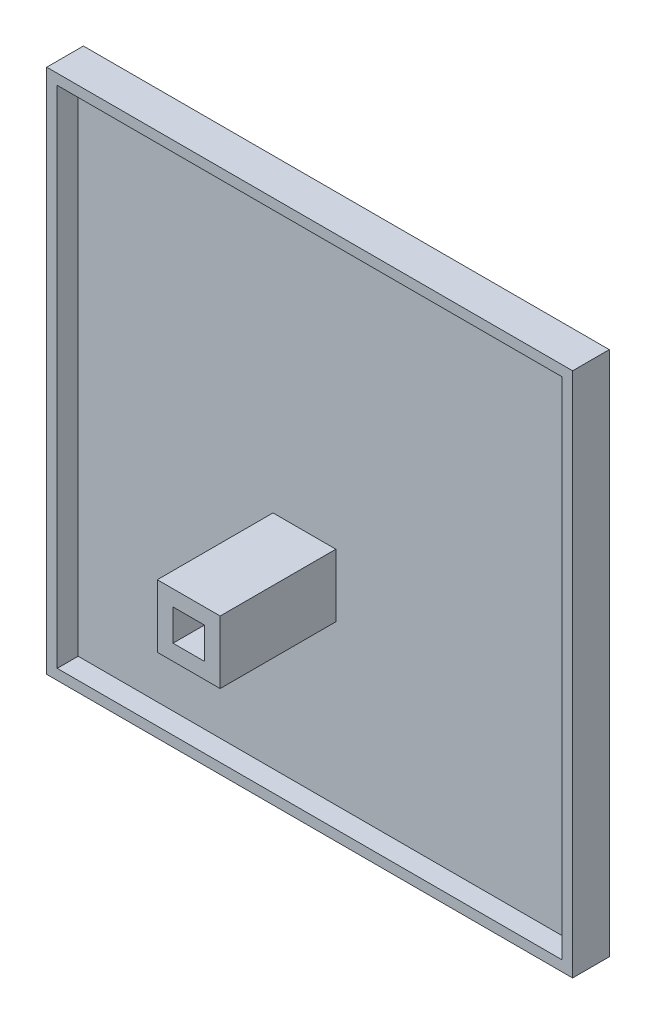
ISO-10303-21;
HEADER;
FILE_DESCRIPTION(('STEP AP214'),'2;1');
FILE_NAME('part.step','',(''),(''),'','','');
FILE_SCHEMA(('AUTOMOTIVE_DESIGN { 1 0 10303 214 1 1 1 1 }'));
ENDSEC;
DATA;
#1=APPLICATION_CONTEXT('core data for automotive mechanical design processes');
#2=APPLICATION_PROTOCOL_DEFINITION('international standard','automotive_design',2000,#1);
#3=PRODUCT_CONTEXT('',#1,'mechanical');
#4=PRODUCT('Part','Part','',(#3));
#5=PRODUCT_RELATED_PRODUCT_CATEGORY('part','',(#4));
#6=PRODUCT_DEFINITION_FORMATION('','',#4);
#7=PRODUCT_DEFINITION_CONTEXT('part definition',#1,'design');
#8=PRODUCT_DEFINITION('design','',#6,#7);
#9=PRODUCT_DEFINITION_SHAPE('','',#8);
#10=(LENGTH_UNIT() NAMED_UNIT(*) SI_UNIT(.MILLI.,.METRE.));
#11=(NAMED_UNIT(*) PLANE_ANGLE_UNIT() SI_UNIT($,.RADIAN.));
#12=(NAMED_UNIT(*) SI_UNIT($,.STERADIAN.) SOLID_ANGLE_UNIT());
#13=UNCERTAINTY_MEASURE_WITH_UNIT(LENGTH_MEASURE(1.E-05),#10,'distance_accuracy_value','');
#14=(GEOMETRIC_REPRESENTATION_CONTEXT(3) GLOBAL_UNCERTAINTY_ASSIGNED_CONTEXT((#13)) GLOBAL_UNIT_ASSIGNED_CONTEXT((#10,
#11,#12)) REPRESENTATION_CONTEXT('',''));
#15=CARTESIAN_POINT('',(0.,0.,0.));
#16=DIRECTION('',(0.,0.,1.));
#17=DIRECTION('',(1.,0.,0.));
#18=AXIS2_PLACEMENT_3D('',#15,#16,#17);
#19=CARTESIAN_POINT('',(42.2,-59.1,2.));
#20=DIRECTION('',(-1.,0.,0.));
#21=DIRECTION('',(0.,-1.,0.));
#22=AXIS2_PLACEMENT_3D('',#19,#20,#21);
#23=PLANE('',#22);
#24=DIRECTION('',(0.,-1.,0.));
#25=VECTOR('',#24,1.);
#26=CARTESIAN_POINT('',(42.2,-59.1,4.));
#27=LINE('',#26,#25);
#28=CARTESIAN_POINT('',(42.2,-59.1,4.));
#29=VERTEX_POINT('',#28);
#30=CARTESIAN_POINT('',(42.2,-65.1,4.));
#31=VERTEX_POINT('',#30);
#32=EDGE_CURVE('E61',#29,#31,#27,.T.);
#33=ORIENTED_EDGE('',*,*,#32,.F.);
#34=DIRECTION('',(0.,0.,1.));
#35=VECTOR('',#34,1.);
#36=CARTESIAN_POINT('',(42.2,-59.1,2.));
#37=LINE('',#36,#35);
#38=CARTESIAN_POINT('',(42.2,-59.1,24.09));
#39=VERTEX_POINT('',#38);
#40=EDGE_CURVE('E220',#29,#39,#37,.T.);
#41=ORIENTED_EDGE('',*,*,#40,.T.);
#42=DIRECTION('',(0.,-1.,0.));
#43=VECTOR('',#42,1.);
#44=CARTESIAN_POINT('',(42.2,-59.1,24.09));
#45=LINE('',#44,#43);
#46=CARTESIAN_POINT('',(42.2,-65.1,24.09));
#47=VERTEX_POINT('',#46);
#48=EDGE_CURVE('E203',#39,#47,#45,.T.);
#49=ORIENTED_EDGE('',*,*,#48,.T.);
#50=DIRECTION('',(0.,0.,1.));
#51=VECTOR('',#50,1.);
#52=CARTESIAN_POINT('',(42.2,-65.1,2.));
#53=LINE('',#52,#51);
#54=EDGE_CURVE('E219',#31,#47,#53,.T.);
#55=ORIENTED_EDGE('',*,*,#54,.F.);
#56=EDGE_LOOP('',(#33,#41,#49,#55));
#57=FACE_BOUND('',#56,.T.);
#58=ADVANCED_FACE('F45',(#57),#23,.F.);
#59=CARTESIAN_POINT('',(42.2,-59.1,2.));
#60=DIRECTION('',(0.,1.,0.));
#61=DIRECTION('',(0.,0.,1.));
#62=AXIS2_PLACEMENT_3D('',#59,#60,#61);
#63=PLANE('',#62);
#64=DIRECTION('',(-1.,0.,0.));
#65=VECTOR('',#64,1.);
#66=CARTESIAN_POINT('',(48.2,-59.1,4.));
#67=LINE('',#66,#65);
#68=CARTESIAN_POINT('',(48.2,-59.1,4.));
#69=VERTEX_POINT('',#68);
#70=EDGE_CURVE('E68',#69,#29,#67,.T.);
#71=ORIENTED_EDGE('',*,*,#70,.F.);
#72=DIRECTION('',(0.,0.,1.));
#73=VECTOR('',#72,1.);
#74=CARTESIAN_POINT('',(48.2,-59.1,2.));
#75=LINE('',#74,#73);
#76=CARTESIAN_POINT('',(48.2,-59.1,24.09));
#77=VERTEX_POINT('',#76);
#78=EDGE_CURVE('E224',#69,#77,#75,.T.);
#79=ORIENTED_EDGE('',*,*,#78,.T.);
#80=DIRECTION('',(-1.,0.,0.));
#81=VECTOR('',#80,1.);
#82=CARTESIAN_POINT('',(42.2,-59.1,24.09));
#83=LINE('',#82,#81);
#84=EDGE_CURVE('E215',#77,#39,#83,.T.);
#85=ORIENTED_EDGE('',*,*,#84,.T.);
#86=ORIENTED_EDGE('',*,*,#40,.F.);
#87=EDGE_LOOP('',(#71,#79,#85,#86));
#88=FACE_BOUND('',#87,.T.);
#89=ADVANCED_FACE('F353',(#88),#63,.F.);
#90=CARTESIAN_POINT('',(48.2,-59.1,2.));
#91=DIRECTION('',(1.,0.,0.));
#92=DIRECTION('',(0.,0.,-1.));
#93=AXIS2_PLACEMENT_3D('',#90,#91,#92);
#94=PLANE('',#93);
#95=DIRECTION('',(0.,1.,0.));
#96=VECTOR('',#95,1.);
#97=CARTESIAN_POINT('',(48.2,-59.1,4.));
#98=LINE('',#97,#96);
#99=CARTESIAN_POINT('',(48.2,-65.1,4.));
#100=VERTEX_POINT('',#99);
#101=EDGE_CURVE('E191',#100,#69,#98,.T.);
#102=ORIENTED_EDGE('',*,*,#101,.F.);
#103=DIRECTION('',(0.,0.,1.));
#104=VECTOR('',#103,1.);
#105=CARTESIAN_POINT('',(48.2,-65.1,2.));
#106=LINE('',#105,#104);
#107=CARTESIAN_POINT('',(48.2,-65.1,24.09));
#108=VERTEX_POINT('',#107);
#109=EDGE_CURVE('E227',#100,#108,#106,.T.);
#110=ORIENTED_EDGE('',*,*,#109,.T.);
#111=DIRECTION('',(0.,1.,0.));
#112=VECTOR('',#111,1.);
#113=CARTESIAN_POINT('',(48.2,-59.1,24.09));
#114=LINE('',#113,#112);
#115=EDGE_CURVE('E211',#108,#77,#114,.T.);
#116=ORIENTED_EDGE('',*,*,#115,.T.);
#117=ORIENTED_EDGE('',*,*,#78,.F.);
#118=EDGE_LOOP('',(#102,#110,#116,#117));
#119=FACE_BOUND('',#118,.T.);
#120=ADVANCED_FACE('F358',(#119),#94,.F.);
#121=CARTESIAN_POINT('',(42.2,-65.1,2.));
#122=DIRECTION('',(0.,-1.,0.));
#123=DIRECTION('',(0.,0.,-1.));
#124=AXIS2_PLACEMENT_3D('',#121,#122,#123);
#125=PLANE('',#124);
#126=DIRECTION('',(1.,0.,0.));
#127=VECTOR('',#126,1.);
#128=CARTESIAN_POINT('',(48.2,-65.1,4.));
#129=LINE('',#128,#127);
#130=EDGE_CURVE('E199',#31,#100,#129,.T.);
#131=ORIENTED_EDGE('',*,*,#130,.F.);
#132=ORIENTED_EDGE('',*,*,#54,.T.);
#133=DIRECTION('',(1.,0.,0.));
#134=VECTOR('',#133,1.);
#135=CARTESIAN_POINT('',(42.2,-65.1,24.09));
#136=LINE('',#135,#134);
#137=EDGE_CURVE('E207',#47,#108,#136,.T.);
#138=ORIENTED_EDGE('',*,*,#137,.T.);
#139=ORIENTED_EDGE('',*,*,#109,.F.);
#140=EDGE_LOOP('',(#131,#132,#138,#139));
#141=FACE_BOUND('',#140,.T.);
#142=ADVANCED_FACE('F362',(#141),#125,.F.);
#143=CARTESIAN_POINT('',(0.,0.,2.));
#144=DIRECTION('',(0.,0.,1.));
#145=DIRECTION('',(1.,0.,0.));
#146=AXIS2_PLACEMENT_3D('',#143,#144,#145);
#147=PLANE('',#146);
#148=DIRECTION('',(-1.,0.,0.));
#149=VECTOR('',#148,1.);
#150=CARTESIAN_POINT('',(0.,-98.4,2.));
#151=LINE('',#150,#149);
#152=CARTESIAN_POINT('',(98.4,-98.4,2.));
#153=VERTEX_POINT('',#152);
#154=CARTESIAN_POINT('',(2.00000000000001,-98.4,2.));
#155=VERTEX_POINT('',#154);
#156=EDGE_CURVE('E302',#153,#155,#151,.T.);
#157=ORIENTED_EDGE('',*,*,#156,.F.);
#158=DIRECTION('',(0.,-1.,0.));
#159=VECTOR('',#158,1.);
#160=CARTESIAN_POINT('',(98.4,-2.00000000000001,2.));
#161=LINE('',#160,#159);
#162=CARTESIAN_POINT('',(98.4,-2.00000000000001,2.));
#163=VERTEX_POINT('',#162);
#164=EDGE_CURVE('E280',#163,#153,#161,.T.);
#165=ORIENTED_EDGE('',*,*,#164,.F.);
#166=DIRECTION('',(-1.,0.,0.));
#167=VECTOR('',#166,1.);
#168=CARTESIAN_POINT('',(0.,-2.00000000000001,2.));
#169=LINE('',#168,#167);
#170=CARTESIAN_POINT('',(2.,-2.00000000000001,2.));
#171=VERTEX_POINT('',#170);
#172=EDGE_CURVE('E310',#163,#171,#169,.T.);
#173=ORIENTED_EDGE('',*,*,#172,.T.);
#174=DIRECTION('',(0.,1.,0.));
#175=VECTOR('',#174,1.);
#176=CARTESIAN_POINT('',(2.,-2.00000000000001,2.));
#177=LINE('',#176,#175);
#178=EDGE_CURVE('E283',#155,#171,#177,.T.);
#179=ORIENTED_EDGE('',*,*,#178,.F.);
#180=EDGE_LOOP('',(#157,#165,#173,#179));
#181=FACE_BOUND('',#180,.T.);
#182=DIRECTION('',(1.,0.,0.));
#183=VECTOR('',#182,1.);
#184=CARTESIAN_POINT('',(39.2,-68.1,2.));
#185=LINE('',#184,#183);
#186=CARTESIAN_POINT('',(39.2,-68.1,2.));
#187=VERTEX_POINT('',#186);
#188=CARTESIAN_POINT('',(51.2,-68.1,2.));
#189=VERTEX_POINT('',#188);
#190=EDGE_CURVE('E250',#187,#189,#185,.T.);
#191=ORIENTED_EDGE('',*,*,#190,.F.);
#192=DIRECTION('',(0.,-1.,0.));
#193=VECTOR('',#192,1.);
#194=CARTESIAN_POINT('',(39.2,-56.1,2.));
#195=LINE('',#194,#193);
#196=CARTESIAN_POINT('',(39.2,-56.1,2.));
#197=VERTEX_POINT('',#196);
#198=EDGE_CURVE('E223',#197,#187,#195,.T.);
#199=ORIENTED_EDGE('',*,*,#198,.F.);
#200=DIRECTION('',(-1.,0.,0.));
#201=VECTOR('',#200,1.);
#202=CARTESIAN_POINT('',(39.2,-56.1,2.));
#203=LINE('',#202,#201);
#204=CARTESIAN_POINT('',(51.2,-56.1,2.));
#205=VERTEX_POINT('',#204);
#206=EDGE_CURVE('E237',#205,#197,#203,.T.);
#207=ORIENTED_EDGE('',*,*,#206,.F.);
#208=DIRECTION('',(0.,1.,0.));
#209=VECTOR('',#208,1.);
#210=CARTESIAN_POINT('',(51.2,-56.1,2.));
#211=LINE('',#210,#209);
#212=EDGE_CURVE('E253',#189,#205,#211,.T.);
#213=ORIENTED_EDGE('',*,*,#212,.F.);
#214=EDGE_LOOP('',(#191,#199,#207,#213));
#215=FACE_BOUND('',#214,.T.);
#216=ADVANCED_FACE('F395',(#181,#215),#147,.T.);
#217=CARTESIAN_POINT('',(0.,-2.00000000000001,6.));
#218=DIRECTION('',(0.,-1.,0.));
#219=DIRECTION('',(1.,0.,0.));
#220=AXIS2_PLACEMENT_3D('',#217,#218,#219);
#221=PLANE('',#220);
#222=ORIENTED_EDGE('',*,*,#172,.F.);
#223=DIRECTION('',(0.,0.,-1.));
#224=VECTOR('',#223,1.);
#225=CARTESIAN_POINT('',(98.4,-2.00000000000001,6.));
#226=LINE('',#225,#224);
#227=CARTESIAN_POINT('',(98.4,-2.00000000000001,6.));
#228=VERTEX_POINT('',#227);
#229=EDGE_CURVE('E272',#228,#163,#226,.T.);
#230=ORIENTED_EDGE('',*,*,#229,.F.);
#231=DIRECTION('',(-1.,0.,0.));
#232=VECTOR('',#231,1.);
#233=CARTESIAN_POINT('',(0.,-2.00000000000001,6.));
#234=LINE('',#233,#232);
#235=CARTESIAN_POINT('',(2.,-2.00000000000001,6.));
#236=VERTEX_POINT('',#235);
#237=EDGE_CURVE('E313',#228,#236,#234,.T.);
#238=ORIENTED_EDGE('',*,*,#237,.T.);
#239=DIRECTION('',(0.,0.,-1.));
#240=VECTOR('',#239,1.);
#241=CARTESIAN_POINT('',(2.,-2.00000000000001,6.));
#242=LINE('',#241,#240);
#243=EDGE_CURVE('E291',#236,#171,#242,.T.);
#244=ORIENTED_EDGE('',*,*,#243,.T.);
#245=EDGE_LOOP('',(#222,#230,#238,#244));
#246=FACE_BOUND('',#245,.T.);
#247=ADVANCED_FACE('F389',(#246),#221,.T.);
#248=CARTESIAN_POINT('',(0.,-98.4,6.));
#249=DIRECTION('',(0.,-1.,0.));
#250=DIRECTION('',(1.,0.,0.));
#251=AXIS2_PLACEMENT_3D('',#248,#249,#250);
#252=PLANE('',#251);
#253=DIRECTION('',(0.,0.,-1.));
#254=VECTOR('',#253,1.);
#255=CARTESIAN_POINT('',(98.4,-98.4,6.));
#256=LINE('',#255,#254);
#257=CARTESIAN_POINT('',(98.4,-98.4,6.));
#258=VERTEX_POINT('',#257);
#259=EDGE_CURVE('E275',#258,#153,#256,.T.);
#260=ORIENTED_EDGE('',*,*,#259,.T.);
#261=ORIENTED_EDGE('',*,*,#156,.T.);
#262=DIRECTION('',(0.,0.,-1.));
#263=VECTOR('',#262,1.);
#264=CARTESIAN_POINT('',(2.00000000000001,-98.4,6.));
#265=LINE('',#264,#263);
#266=CARTESIAN_POINT('',(2.00000000000001,-98.4,6.));
#267=VERTEX_POINT('',#266);
#268=EDGE_CURVE('E298',#267,#155,#265,.T.);
#269=ORIENTED_EDGE('',*,*,#268,.F.);
#270=DIRECTION('',(-1.,0.,0.));
#271=VECTOR('',#270,1.);
#272=CARTESIAN_POINT('',(0.,-98.4,6.));
#273=LINE('',#272,#271);
#274=EDGE_CURVE('E303',#258,#267,#273,.T.);
#275=ORIENTED_EDGE('',*,*,#274,.F.);
#276=EDGE_LOOP('',(#260,#261,#269,#275));
#277=FACE_BOUND('',#276,.T.);
#278=ADVANCED_FACE('F387',(#277),#252,.F.);
#279=CARTESIAN_POINT('',(0.,0.,2.));
#280=DIRECTION('',(1.,0.,0.));
#281=DIRECTION('',(0.,1.,0.));
#282=AXIS2_PLACEMENT_3D('',#279,#280,#281);
#283=PLANE('',#282);
#284=DIRECTION('',(0.,0.,-1.));
#285=VECTOR('',#284,1.);
#286=CARTESIAN_POINT('',(0.,0.,2.));
#287=LINE('',#286,#285);
#288=CARTESIAN_POINT('',(0.,0.,6.));
#289=VERTEX_POINT('',#288);
#290=CARTESIAN_POINT('',(0.,0.,-1.));
#291=VERTEX_POINT('',#290);
#292=EDGE_CURVE('E159',#289,#291,#287,.T.);
#293=ORIENTED_EDGE('',*,*,#292,.T.);
#294=DIRECTION('',(0.,1.,0.));
#295=VECTOR('',#294,1.);
#296=CARTESIAN_POINT('',(0.,0.,-1.));
#297=LINE('',#296,#295);
#298=CARTESIAN_POINT('',(0.,-100.4,-1.));
#299=VERTEX_POINT('',#298);
#300=EDGE_CURVE('E163',#299,#291,#297,.T.);
#301=ORIENTED_EDGE('',*,*,#300,.F.);
#302=DIRECTION('',(0.,0.,-1.));
#303=VECTOR('',#302,1.);
#304=CARTESIAN_POINT('',(0.,-100.4,2.));
#305=LINE('',#304,#303);
#306=CARTESIAN_POINT('',(0.,-100.4,6.));
#307=VERTEX_POINT('',#306);
#308=EDGE_CURVE('E11',#307,#299,#305,.T.);
#309=ORIENTED_EDGE('',*,*,#308,.F.);
#310=DIRECTION('',(0.,-1.,0.));
#311=VECTOR('',#310,1.);
#312=CARTESIAN_POINT('',(0.,0.,6.));
#313=LINE('',#312,#311);
#314=EDGE_CURVE('E164',#289,#307,#313,.T.);
#315=ORIENTED_EDGE('',*,*,#314,.F.);
#316=EDGE_LOOP('',(#293,#301,#309,#315));
#317=FACE_BOUND('',#316,.T.);
#318=ADVANCED_FACE('F47',(#317),#283,.F.);
#319=CARTESIAN_POINT('',(0.,-100.4,2.));
#320=DIRECTION('',(0.,1.,0.));
#321=DIRECTION('',(0.,0.,1.));
#322=AXIS2_PLACEMENT_3D('',#319,#320,#321);
#323=PLANE('',#322);
#324=ORIENTED_EDGE('',*,*,#308,.T.);
#325=DIRECTION('',(-1.,0.,0.));
#326=VECTOR('',#325,1.);
#327=CARTESIAN_POINT('',(0.,-100.4,-1.));
#328=LINE('',#327,#326);
#329=CARTESIAN_POINT('',(100.4,-100.4,-1.));
#330=VERTEX_POINT('',#329);
#331=EDGE_CURVE('E183',#330,#299,#328,.T.);
#332=ORIENTED_EDGE('',*,*,#331,.F.);
#333=DIRECTION('',(0.,0.,-1.));
#334=VECTOR('',#333,1.);
#335=CARTESIAN_POINT('',(100.4,-100.4,2.));
#336=LINE('',#335,#334);
#337=CARTESIAN_POINT('',(100.4,-100.4,6.));
#338=VERTEX_POINT('',#337);
#339=EDGE_CURVE('E54',#338,#330,#336,.T.);
#340=ORIENTED_EDGE('',*,*,#339,.F.);
#341=DIRECTION('',(1.,0.,0.));
#342=VECTOR('',#341,1.);
#343=CARTESIAN_POINT('',(0.,-100.4,6.));
#344=LINE('',#343,#342);
#345=EDGE_CURVE('E306',#307,#338,#344,.T.);
#346=ORIENTED_EDGE('',*,*,#345,.F.);
#347=EDGE_LOOP('',(#324,#332,#340,#346));
#348=FACE_BOUND('',#347,.T.);
#349=ADVANCED_FACE('F334',(#348),#323,.F.);
#350=CARTESIAN_POINT('',(100.4,0.,2.));
#351=DIRECTION('',(1.,0.,0.));
#352=DIRECTION('',(0.,1.,0.));
#353=AXIS2_PLACEMENT_3D('',#350,#351,#352);
#354=PLANE('',#353);
#355=ORIENTED_EDGE('',*,*,#339,.T.);
#356=DIRECTION('',(0.,-1.,0.));
#357=VECTOR('',#356,1.);
#358=CARTESIAN_POINT('',(100.4,0.,-1.));
#359=LINE('',#358,#357);
#360=CARTESIAN_POINT('',(100.4,0.,-1.));
#361=VERTEX_POINT('',#360);
#362=EDGE_CURVE('E178',#361,#330,#359,.T.);
#363=ORIENTED_EDGE('',*,*,#362,.F.);
#364=DIRECTION('',(0.,0.,-1.));
#365=VECTOR('',#364,1.);
#366=CARTESIAN_POINT('',(100.4,0.,2.));
#367=LINE('',#366,#365);
#368=CARTESIAN_POINT('',(100.4,0.,6.));
#369=VERTEX_POINT('',#368);
#370=EDGE_CURVE('E169',#369,#361,#367,.T.);
#371=ORIENTED_EDGE('',*,*,#370,.F.);
#372=DIRECTION('',(0.,1.,0.));
#373=VECTOR('',#372,1.);
#374=CARTESIAN_POINT('',(100.4,0.,6.));
#375=LINE('',#374,#373);
#376=EDGE_CURVE('E316',#338,#369,#375,.T.);
#377=ORIENTED_EDGE('',*,*,#376,.F.);
#378=EDGE_LOOP('',(#355,#363,#371,#377));
#379=FACE_BOUND('',#378,.T.);
#380=ADVANCED_FACE('F331',(#379),#354,.T.);
#381=CARTESIAN_POINT('',(0.,0.,2.));
#382=DIRECTION('',(0.,1.,0.));
#383=DIRECTION('',(0.,0.,1.));
#384=AXIS2_PLACEMENT_3D('',#381,#382,#383);
#385=PLANE('',#384);
#386=ORIENTED_EDGE('',*,*,#370,.T.);
#387=DIRECTION('',(1.,0.,0.));
#388=VECTOR('',#387,1.);
#389=CARTESIAN_POINT('',(0.,0.,-1.));
#390=LINE('',#389,#388);
#391=EDGE_CURVE('E172',#291,#361,#390,.T.);
#392=ORIENTED_EDGE('',*,*,#391,.F.);
#393=ORIENTED_EDGE('',*,*,#292,.F.);
#394=DIRECTION('',(-1.,0.,0.));
#395=VECTOR('',#394,1.);
#396=CARTESIAN_POINT('',(0.,0.,6.));
#397=LINE('',#396,#395);
#398=EDGE_CURVE('E320',#369,#289,#397,.T.);
#399=ORIENTED_EDGE('',*,*,#398,.F.);
#400=EDGE_LOOP('',(#386,#392,#393,#399));
#401=FACE_BOUND('',#400,.T.);
#402=ADVANCED_FACE('F173',(#401),#385,.T.);
#403=CARTESIAN_POINT('',(0.,0.,6.));
#404=DIRECTION('',(0.,0.,1.));
#405=DIRECTION('',(1.,0.,0.));
#406=AXIS2_PLACEMENT_3D('',#403,#404,#405);
#407=PLANE('',#406);
#408=ORIENTED_EDGE('',*,*,#237,.F.);
#409=DIRECTION('',(0.,-1.,0.));
#410=VECTOR('',#409,1.);
#411=CARTESIAN_POINT('',(98.4,-2.00000000000001,6.));
#412=LINE('',#411,#410);
#413=EDGE_CURVE('E279',#228,#258,#412,.T.);
#414=ORIENTED_EDGE('',*,*,#413,.T.);
#415=ORIENTED_EDGE('',*,*,#274,.T.);
#416=DIRECTION('',(0.,1.,0.));
#417=VECTOR('',#416,1.);
#418=CARTESIAN_POINT('',(2.,-2.00000000000001,6.));
#419=LINE('',#418,#417);
#420=EDGE_CURVE('E287',#267,#236,#419,.T.);
#421=ORIENTED_EDGE('',*,*,#420,.T.);
#422=EDGE_LOOP('',(#408,#414,#415,#421));
#423=FACE_BOUND('',#422,.T.);
#424=ORIENTED_EDGE('',*,*,#345,.T.);
#425=ORIENTED_EDGE('',*,*,#376,.T.);
#426=ORIENTED_EDGE('',*,*,#398,.T.);
#427=ORIENTED_EDGE('',*,*,#314,.T.);
#428=EDGE_LOOP('',(#424,#425,#426,#427));
#429=FACE_BOUND('',#428,.T.);
#430=ADVANCED_FACE('F336',(#423,#429),#407,.T.);
#431=CARTESIAN_POINT('',(2.,-2.00000000000001,6.));
#432=DIRECTION('',(-1.,0.,0.));
#433=DIRECTION('',(0.,-1.,0.));
#434=AXIS2_PLACEMENT_3D('',#431,#432,#433);
#435=PLANE('',#434);
#436=ORIENTED_EDGE('',*,*,#178,.T.);
#437=ORIENTED_EDGE('',*,*,#243,.F.);
#438=ORIENTED_EDGE('',*,*,#420,.F.);
#439=ORIENTED_EDGE('',*,*,#268,.T.);
#440=EDGE_LOOP('',(#436,#437,#438,#439));
#441=FACE_BOUND('',#440,.T.);
#442=ADVANCED_FACE('F338',(#441),#435,.F.);
#443=CARTESIAN_POINT('',(98.4,-2.00000000000001,6.));
#444=DIRECTION('',(1.,0.,0.));
#445=DIRECTION('',(0.,1.,0.));
#446=AXIS2_PLACEMENT_3D('',#443,#444,#445);
#447=PLANE('',#446);
#448=ORIENTED_EDGE('',*,*,#164,.T.);
#449=ORIENTED_EDGE('',*,*,#259,.F.);
#450=ORIENTED_EDGE('',*,*,#413,.F.);
#451=ORIENTED_EDGE('',*,*,#229,.T.);
#452=EDGE_LOOP('',(#448,#449,#450,#451));
#453=FACE_BOUND('',#452,.T.);
#454=ADVANCED_FACE('F345',(#453),#447,.F.);
#455=CARTESIAN_POINT('',(39.2,-56.1,24.09));
#456=DIRECTION('',(1.,0.,0.));
#457=DIRECTION('',(0.,1.,0.));
#458=AXIS2_PLACEMENT_3D('',#455,#456,#457);
#459=PLANE('',#458);
#460=ORIENTED_EDGE('',*,*,#198,.T.);
#461=DIRECTION('',(0.,0.,-1.));
#462=VECTOR('',#461,1.);
#463=CARTESIAN_POINT('',(39.2,-68.1,24.09));
#464=LINE('',#463,#462);
#465=CARTESIAN_POINT('',(39.2,-68.1,24.09));
#466=VERTEX_POINT('',#465);
#467=EDGE_CURVE('E269',#466,#187,#464,.T.);
#468=ORIENTED_EDGE('',*,*,#467,.F.);
#469=DIRECTION('',(0.,-1.,0.));
#470=VECTOR('',#469,1.);
#471=CARTESIAN_POINT('',(39.2,-56.1,24.09));
#472=LINE('',#471,#470);
#473=CARTESIAN_POINT('',(39.2,-56.1,24.09));
#474=VERTEX_POINT('',#473);
#475=EDGE_CURVE('E232',#474,#466,#472,.T.);
#476=ORIENTED_EDGE('',*,*,#475,.F.);
#477=DIRECTION('',(0.,0.,-1.));
#478=VECTOR('',#477,1.);
#479=CARTESIAN_POINT('',(39.2,-56.1,24.09));
#480=LINE('',#479,#478);
#481=EDGE_CURVE('E246',#474,#197,#480,.T.);
#482=ORIENTED_EDGE('',*,*,#481,.T.);
#483=EDGE_LOOP('',(#460,#468,#476,#482));
#484=FACE_BOUND('',#483,.T.);
#485=ADVANCED_FACE('F380',(#484),#459,.F.);
#486=CARTESIAN_POINT('',(39.2,-68.1,24.09));
#487=DIRECTION('',(0.,1.,0.));
#488=DIRECTION('',(0.,0.,1.));
#489=AXIS2_PLACEMENT_3D('',#486,#487,#488);
#490=PLANE('',#489);
#491=ORIENTED_EDGE('',*,*,#190,.T.);
#492=DIRECTION('',(0.,0.,-1.));
#493=VECTOR('',#492,1.);
#494=CARTESIAN_POINT('',(51.2,-68.1,24.09));
#495=LINE('',#494,#493);
#496=CARTESIAN_POINT('',(51.2,-68.1,24.09));
#497=VERTEX_POINT('',#496);
#498=EDGE_CURVE('E265',#497,#189,#495,.T.);
#499=ORIENTED_EDGE('',*,*,#498,.F.);
#500=DIRECTION('',(1.,0.,0.));
#501=VECTOR('',#500,1.);
#502=CARTESIAN_POINT('',(39.2,-68.1,24.09));
#503=LINE('',#502,#501);
#504=EDGE_CURVE('E236',#466,#497,#503,.T.);
#505=ORIENTED_EDGE('',*,*,#504,.F.);
#506=ORIENTED_EDGE('',*,*,#467,.T.);
#507=EDGE_LOOP('',(#491,#499,#505,#506));
#508=FACE_BOUND('',#507,.T.);
#509=ADVANCED_FACE('F376',(#508),#490,.F.);
#510=CARTESIAN_POINT('',(51.2,-56.1,24.09));
#511=DIRECTION('',(-1.,0.,0.));
#512=DIRECTION('',(0.,0.,1.));
#513=AXIS2_PLACEMENT_3D('',#510,#511,#512);
#514=PLANE('',#513);
#515=ORIENTED_EDGE('',*,*,#212,.T.);
#516=DIRECTION('',(0.,0.,-1.));
#517=VECTOR('',#516,1.);
#518=CARTESIAN_POINT('',(51.2,-56.1,24.09));
#519=LINE('',#518,#517);
#520=CARTESIAN_POINT('',(51.2,-56.1,24.09));
#521=VERTEX_POINT('',#520);
#522=EDGE_CURVE('E262',#521,#205,#519,.T.);
#523=ORIENTED_EDGE('',*,*,#522,.F.);
#524=DIRECTION('',(0.,1.,0.));
#525=VECTOR('',#524,1.);
#526=CARTESIAN_POINT('',(51.2,-56.1,24.09));
#527=LINE('',#526,#525);
#528=EDGE_CURVE('E240',#497,#521,#527,.T.);
#529=ORIENTED_EDGE('',*,*,#528,.F.);
#530=ORIENTED_EDGE('',*,*,#498,.T.);
#531=EDGE_LOOP('',(#515,#523,#529,#530));
#532=FACE_BOUND('',#531,.T.);
#533=ADVANCED_FACE('F372',(#532),#514,.F.);
#534=CARTESIAN_POINT('',(39.2,-56.1,24.09));
#535=DIRECTION('',(0.,-1.,0.));
#536=DIRECTION('',(0.,0.,-1.));
#537=AXIS2_PLACEMENT_3D('',#534,#535,#536);
#538=PLANE('',#537);
#539=ORIENTED_EDGE('',*,*,#206,.T.);
#540=ORIENTED_EDGE('',*,*,#481,.F.);
#541=DIRECTION('',(-1.,0.,0.));
#542=VECTOR('',#541,1.);
#543=CARTESIAN_POINT('',(39.2,-56.1,24.09));
#544=LINE('',#543,#542);
#545=EDGE_CURVE('E243',#521,#474,#544,.T.);
#546=ORIENTED_EDGE('',*,*,#545,.F.);
#547=ORIENTED_EDGE('',*,*,#522,.T.);
#548=EDGE_LOOP('',(#539,#540,#546,#547));
#549=FACE_BOUND('',#548,.T.);
#550=ADVANCED_FACE('F368',(#549),#538,.F.);
#551=CARTESIAN_POINT('',(0.,0.,24.09));
#552=DIRECTION('',(0.,0.,1.));
#553=DIRECTION('',(1.,0.,0.));
#554=AXIS2_PLACEMENT_3D('',#551,#552,#553);
#555=PLANE('',#554);
#556=ORIENTED_EDGE('',*,*,#48,.F.);
#557=ORIENTED_EDGE('',*,*,#84,.F.);
#558=ORIENTED_EDGE('',*,*,#115,.F.);
#559=ORIENTED_EDGE('',*,*,#137,.F.);
#560=EDGE_LOOP('',(#556,#557,#558,#559));
#561=FACE_BOUND('',#560,.T.);
#562=ORIENTED_EDGE('',*,*,#475,.T.);
#563=ORIENTED_EDGE('',*,*,#504,.T.);
#564=ORIENTED_EDGE('',*,*,#528,.T.);
#565=ORIENTED_EDGE('',*,*,#545,.T.);
#566=EDGE_LOOP('',(#562,#563,#564,#565));
#567=FACE_BOUND('',#566,.T.);
#568=ADVANCED_FACE('F364',(#561,#567),#555,.T.);
#569=CARTESIAN_POINT('',(0.,0.,4.));
#570=DIRECTION('',(0.,0.,-1.));
#571=DIRECTION('',(-1.,0.,0.));
#572=AXIS2_PLACEMENT_3D('',#569,#570,#571);
#573=PLANE('',#572);
#574=ORIENTED_EDGE('',*,*,#101,.T.);
#575=ORIENTED_EDGE('',*,*,#70,.T.);
#576=ORIENTED_EDGE('',*,*,#32,.T.);
#577=ORIENTED_EDGE('',*,*,#130,.T.);
#578=EDGE_LOOP('',(#574,#575,#576,#577));
#579=FACE_BOUND('',#578,.T.);
#580=ADVANCED_FACE('F367',(#579),#573,.F.);
#581=CARTESIAN_POINT('',(0.,0.,-1.));
#582=DIRECTION('',(0.,0.,1.));
#583=DIRECTION('',(1.,0.,0.));
#584=AXIS2_PLACEMENT_3D('',#581,#582,#583);
#585=PLANE('',#584);
#586=ORIENTED_EDGE('',*,*,#300,.T.);
#587=ORIENTED_EDGE('',*,*,#391,.T.);
#588=ORIENTED_EDGE('',*,*,#362,.T.);
#589=ORIENTED_EDGE('',*,*,#331,.T.);
#590=EDGE_LOOP('',(#586,#587,#588,#589));
#591=FACE_BOUND('',#590,.T.);
#592=ADVANCED_FACE('F181',(#591),#585,.F.);
#593=CLOSED_SHELL('',(#58,#89,#120,#142,#216,#247,#278,#318,#349,#380,#402,#430,#442,#454,#485,
#509,#533,#550,#568,#580,#592));
#594=MANIFOLD_SOLID_BREP('B2',#593);
#595=ADVANCED_BREP_SHAPE_REPRESENTATION('',(#18,#594),#14);
#596=SHAPE_DEFINITION_REPRESENTATION(#9,#595);
ENDSEC;
END-ISO-10303-21;
